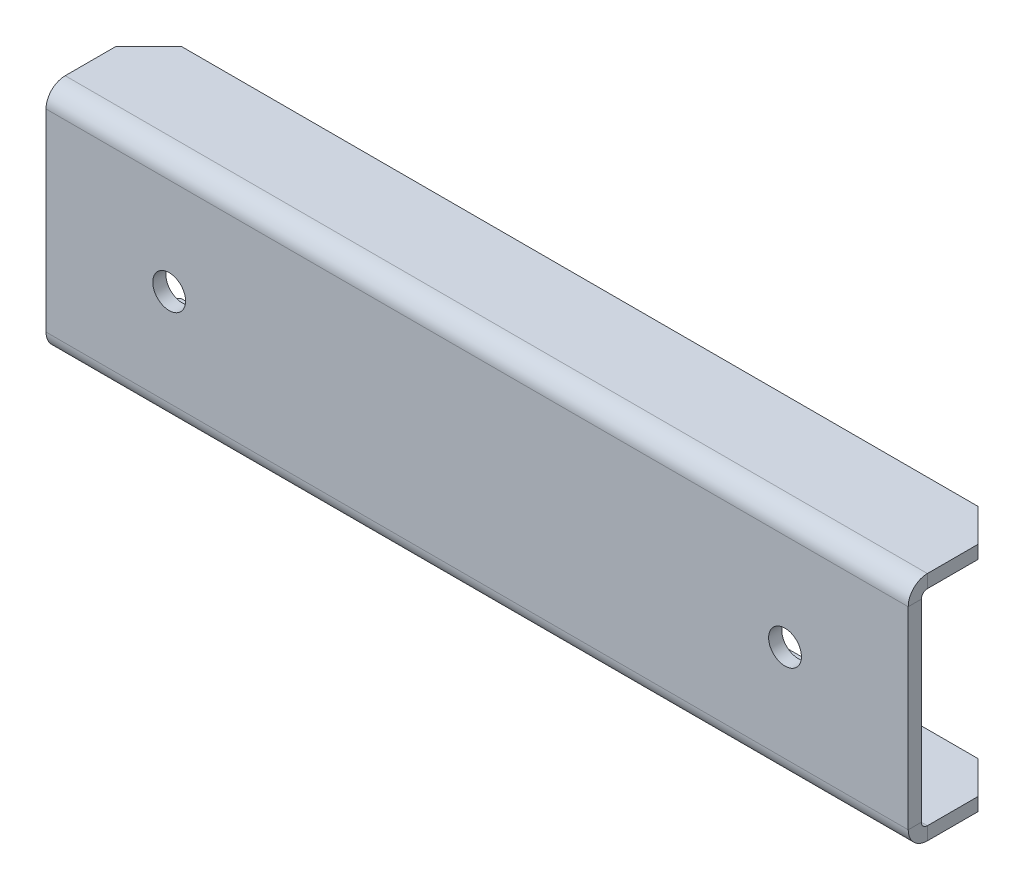
ISO-10303-21;
HEADER;
FILE_DESCRIPTION(('STEP AP214'),'2;1');
FILE_NAME('part.step','',(''),(''),'','','');
FILE_SCHEMA(('AUTOMOTIVE_DESIGN { 1 0 10303 214 1 1 1 1 }'));
ENDSEC;
DATA;
#1=APPLICATION_CONTEXT('core data for automotive mechanical design processes');
#2=APPLICATION_PROTOCOL_DEFINITION('international standard','automotive_design',2000,#1);
#3=PRODUCT_CONTEXT('',#1,'mechanical');
#4=PRODUCT('Part','Part','',(#3));
#5=PRODUCT_RELATED_PRODUCT_CATEGORY('part','',(#4));
#6=PRODUCT_DEFINITION_FORMATION('','',#4);
#7=PRODUCT_DEFINITION_CONTEXT('part definition',#1,'design');
#8=PRODUCT_DEFINITION('design','',#6,#7);
#9=PRODUCT_DEFINITION_SHAPE('','',#8);
#10=(LENGTH_UNIT() NAMED_UNIT(*) SI_UNIT(.MILLI.,.METRE.));
#11=(NAMED_UNIT(*) PLANE_ANGLE_UNIT() SI_UNIT($,.RADIAN.));
#12=(NAMED_UNIT(*) SI_UNIT($,.STERADIAN.) SOLID_ANGLE_UNIT());
#13=UNCERTAINTY_MEASURE_WITH_UNIT(LENGTH_MEASURE(1.E-05),#10,'distance_accuracy_value','');
#14=(GEOMETRIC_REPRESENTATION_CONTEXT(3) GLOBAL_UNCERTAINTY_ASSIGNED_CONTEXT((#13)) GLOBAL_UNIT_ASSIGNED_CONTEXT((#10,
#11,#12)) REPRESENTATION_CONTEXT('',''));
#15=CARTESIAN_POINT('',(0.,0.,0.));
#16=DIRECTION('',(0.,0.,1.));
#17=DIRECTION('',(1.,0.,0.));
#18=AXIS2_PLACEMENT_3D('',#15,#16,#17);
#19=CARTESIAN_POINT('',(-52.5,-12.5,-1.6));
#20=DIRECTION('',(0.,0.,1.));
#21=DIRECTION('',(1.,0.,0.));
#22=AXIS2_PLACEMENT_3D('',#19,#20,#21);
#23=PLANE('',#22);
#24=DIRECTION('',(-1.,0.,0.));
#25=VECTOR('',#24,1.);
#26=CARTESIAN_POINT('',(-52.5,-11.7634,-1.6));
#27=LINE('',#26,#25);
#28=CARTESIAN_POINT('',(-52.5,-11.7634,-1.6));
#29=VERTEX_POINT('',#28);
#30=CARTESIAN_POINT('',(52.5,-11.7634,-1.6));
#31=VERTEX_POINT('',#30);
#32=EDGE_CURVE('E300',#29,#31,#27,.F.);
#33=ORIENTED_EDGE('',*,*,#32,.F.);
#34=DIRECTION('',(0.,-1.,0.));
#35=VECTOR('',#34,1.);
#36=CARTESIAN_POINT('',(-52.5,12.5,-1.6));
#37=LINE('',#36,#35);
#38=CARTESIAN_POINT('',(-52.5,11.7634,-1.6));
#39=VERTEX_POINT('',#38);
#40=EDGE_CURVE('E45',#39,#29,#37,.T.);
#41=ORIENTED_EDGE('',*,*,#40,.F.);
#42=DIRECTION('',(1.,0.,0.));
#43=VECTOR('',#42,1.);
#44=CARTESIAN_POINT('',(52.5,11.7634,-1.6));
#45=LINE('',#44,#43);
#46=CARTESIAN_POINT('',(52.5,11.7634,-1.6));
#47=VERTEX_POINT('',#46);
#48=EDGE_CURVE('E175',#47,#39,#45,.F.);
#49=ORIENTED_EDGE('',*,*,#48,.F.);
#50=DIRECTION('',(0.,1.,0.));
#51=VECTOR('',#50,1.);
#52=CARTESIAN_POINT('',(52.5,12.5,-1.6));
#53=LINE('',#52,#51);
#54=EDGE_CURVE('E11',#31,#47,#53,.T.);
#55=ORIENTED_EDGE('',*,*,#54,.F.);
#56=EDGE_LOOP('',(#33,#41,#49,#55));
#57=FACE_BOUND('',#56,.T.);
#58=CARTESIAN_POINT('',(37.5,0.,-1.6));
#59=DIRECTION('',(0.,0.,-1.));
#60=DIRECTION('',(-1.,0.,0.));
#61=AXIS2_PLACEMENT_3D('',#58,#59,#60);
#62=CIRCLE('',#61,2.);
#63=CARTESIAN_POINT('',(35.5,0.,-1.6));
#64=VERTEX_POINT('',#63);
#65=EDGE_CURVE('E325',#64,#64,#62,.T.);
#66=ORIENTED_EDGE('',*,*,#65,.F.);
#67=EDGE_LOOP('',(#66));
#68=FACE_BOUND('',#67,.T.);
#69=CARTESIAN_POINT('',(-37.5,0.,-1.6));
#70=DIRECTION('',(0.,0.,1.));
#71=DIRECTION('',(1.,0.,0.));
#72=AXIS2_PLACEMENT_3D('',#69,#70,#71);
#73=CIRCLE('',#72,2.);
#74=CARTESIAN_POINT('',(-35.5,0.,-1.6));
#75=VERTEX_POINT('',#74);
#76=EDGE_CURVE('E328',#75,#75,#73,.T.);
#77=ORIENTED_EDGE('',*,*,#76,.T.);
#78=EDGE_LOOP('',(#77));
#79=FACE_BOUND('',#78,.T.);
#80=ADVANCED_FACE('F36',(#57,#68,#79),#23,.F.);
#81=CARTESIAN_POINT('',(-52.5,-12.5,0.));
#82=DIRECTION('',(0.,0.,1.));
#83=DIRECTION('',(1.,0.,0.));
#84=AXIS2_PLACEMENT_3D('',#81,#82,#83);
#85=PLANE('',#84);
#86=DIRECTION('',(0.,-1.,0.));
#87=VECTOR('',#86,1.);
#88=CARTESIAN_POINT('',(-52.5,12.5,0.));
#89=LINE('',#88,#87);
#90=CARTESIAN_POINT('',(-52.5,11.7634,0.));
#91=VERTEX_POINT('',#90);
#92=CARTESIAN_POINT('',(-52.5,-11.7634,0.));
#93=VERTEX_POINT('',#92);
#94=EDGE_CURVE('E207',#91,#93,#89,.T.);
#95=ORIENTED_EDGE('',*,*,#94,.T.);
#96=DIRECTION('',(-1.,0.,0.));
#97=VECTOR('',#96,1.);
#98=CARTESIAN_POINT('',(-52.5,-11.7634,0.));
#99=LINE('',#98,#97);
#100=CARTESIAN_POINT('',(52.5,-11.7634,0.));
#101=VERTEX_POINT('',#100);
#102=EDGE_CURVE('E219',#93,#101,#99,.F.);
#103=ORIENTED_EDGE('',*,*,#102,.T.);
#104=DIRECTION('',(0.,1.,0.));
#105=VECTOR('',#104,1.);
#106=CARTESIAN_POINT('',(52.5,12.5,0.));
#107=LINE('',#106,#105);
#108=CARTESIAN_POINT('',(52.5,11.7634,0.));
#109=VERTEX_POINT('',#108);
#110=EDGE_CURVE('E40',#101,#109,#107,.T.);
#111=ORIENTED_EDGE('',*,*,#110,.T.);
#112=DIRECTION('',(1.,0.,0.));
#113=VECTOR('',#112,1.);
#114=CARTESIAN_POINT('',(52.5,11.7634,0.));
#115=LINE('',#114,#113);
#116=EDGE_CURVE('E190',#109,#91,#115,.F.);
#117=ORIENTED_EDGE('',*,*,#116,.T.);
#118=EDGE_LOOP('',(#95,#103,#111,#117));
#119=FACE_BOUND('',#118,.T.);
#120=CARTESIAN_POINT('',(37.5,0.,0.));
#121=DIRECTION('',(0.,0.,-1.));
#122=DIRECTION('',(-1.,0.,0.));
#123=AXIS2_PLACEMENT_3D('',#120,#121,#122);
#124=CIRCLE('',#123,2.);
#125=CARTESIAN_POINT('',(35.5,0.,0.));
#126=VERTEX_POINT('',#125);
#127=EDGE_CURVE('E335',#126,#126,#124,.T.);
#128=ORIENTED_EDGE('',*,*,#127,.T.);
#129=EDGE_LOOP('',(#128));
#130=FACE_BOUND('',#129,.T.);
#131=CARTESIAN_POINT('',(-37.5,0.,0.));
#132=DIRECTION('',(0.,0.,1.));
#133=DIRECTION('',(1.,0.,0.));
#134=AXIS2_PLACEMENT_3D('',#131,#132,#133);
#135=CIRCLE('',#134,2.);
#136=CARTESIAN_POINT('',(-35.5,0.,0.));
#137=VERTEX_POINT('',#136);
#138=EDGE_CURVE('E330',#137,#137,#135,.T.);
#139=ORIENTED_EDGE('',*,*,#138,.F.);
#140=EDGE_LOOP('',(#139));
#141=FACE_BOUND('',#140,.T.);
#142=ADVANCED_FACE('F217',(#119,#130,#141),#85,.T.);
#143=CARTESIAN_POINT('',(52.5,14.1,-1.59999999999999));
#144=DIRECTION('',(0.,-1.,0.));
#145=DIRECTION('',(0.,0.,-1.));
#146=AXIS2_PLACEMENT_3D('',#143,#144,#145);
#147=PLANE('',#146);
#148=DIRECTION('',(-0.707106781186547,0.,0.707106781186548));
#149=VECTOR('',#148,1.);
#150=CARTESIAN_POINT('',(-3.45000000000006,14.1000000000002,-57.55));
#151=LINE('',#150,#149);
#152=CARTESIAN_POINT('',(-48.5,14.1,-12.5));
#153=VERTEX_POINT('',#152);
#154=CARTESIAN_POINT('',(-52.5,14.1,-8.5));
#155=VERTEX_POINT('',#154);
#156=EDGE_CURVE('E151',#153,#155,#151,.T.);
#157=ORIENTED_EDGE('',*,*,#156,.T.);
#158=DIRECTION('',(0.,0.,1.));
#159=VECTOR('',#158,1.);
#160=CARTESIAN_POINT('',(-52.5,14.1,-1.59999999999999));
#161=LINE('',#160,#159);
#162=CARTESIAN_POINT('',(-52.5,14.1,-2.33659999999999));
#163=VERTEX_POINT('',#162);
#164=EDGE_CURVE('E162',#155,#163,#161,.T.);
#165=ORIENTED_EDGE('',*,*,#164,.T.);
#166=DIRECTION('',(-1.,0.,0.));
#167=VECTOR('',#166,1.);
#168=CARTESIAN_POINT('',(52.5,14.1,-2.3366));
#169=LINE('',#168,#167);
#170=CARTESIAN_POINT('',(52.5,14.1,-2.3366));
#171=VERTEX_POINT('',#170);
#172=EDGE_CURVE('E185',#171,#163,#169,.T.);
#173=ORIENTED_EDGE('',*,*,#172,.F.);
#174=DIRECTION('',(0.,0.,-1.));
#175=VECTOR('',#174,1.);
#176=CARTESIAN_POINT('',(52.5,14.1,-12.5));
#177=LINE('',#176,#175);
#178=CARTESIAN_POINT('',(52.5,14.1,-8.5));
#179=VERTEX_POINT('',#178);
#180=EDGE_CURVE('E177',#171,#179,#177,.T.);
#181=ORIENTED_EDGE('',*,*,#180,.T.);
#182=DIRECTION('',(-0.707106781186547,0.,-0.707106781186548));
#183=VECTOR('',#182,1.);
#184=CARTESIAN_POINT('',(55.95,14.1,-5.04999999999999));
#185=LINE('',#184,#183);
#186=CARTESIAN_POINT('',(48.5,14.1,-12.5));
#187=VERTEX_POINT('',#186);
#188=EDGE_CURVE('E248',#179,#187,#185,.T.);
#189=ORIENTED_EDGE('',*,*,#188,.T.);
#190=DIRECTION('',(-1.,0.,0.));
#191=VECTOR('',#190,1.);
#192=CARTESIAN_POINT('',(-52.5,14.1,-12.5));
#193=LINE('',#192,#191);
#194=EDGE_CURVE('E166',#187,#153,#193,.T.);
#195=ORIENTED_EDGE('',*,*,#194,.T.);
#196=EDGE_LOOP('',(#157,#165,#173,#181,#189,#195));
#197=FACE_BOUND('',#196,.T.);
#198=ADVANCED_FACE('F160',(#197),#147,.F.);
#199=CARTESIAN_POINT('',(52.5,12.5,-1.6));
#200=DIRECTION('',(0.,-1.,0.));
#201=DIRECTION('',(0.,0.,-1.));
#202=AXIS2_PLACEMENT_3D('',#199,#200,#201);
#203=PLANE('',#202);
#204=DIRECTION('',(0.,0.,1.));
#205=VECTOR('',#204,1.);
#206=CARTESIAN_POINT('',(-52.5,12.5,-1.6));
#207=LINE('',#206,#205);
#208=CARTESIAN_POINT('',(-52.5,12.5,-8.50000000000001));
#209=VERTEX_POINT('',#208);
#210=CARTESIAN_POINT('',(-52.5,12.5,-2.3366));
#211=VERTEX_POINT('',#210);
#212=EDGE_CURVE('E188',#209,#211,#207,.T.);
#213=ORIENTED_EDGE('',*,*,#212,.F.);
#214=DIRECTION('',(-0.707106781186547,0.,0.707106781186548));
#215=VECTOR('',#214,1.);
#216=CARTESIAN_POINT('',(-3.45000000000006,12.5000000000002,-57.55));
#217=LINE('',#216,#215);
#218=CARTESIAN_POINT('',(-48.5,12.5,-12.5));
#219=VERTEX_POINT('',#218);
#220=EDGE_CURVE('E53',#219,#209,#217,.T.);
#221=ORIENTED_EDGE('',*,*,#220,.F.);
#222=DIRECTION('',(-1.,0.,0.));
#223=VECTOR('',#222,1.);
#224=CARTESIAN_POINT('',(-52.5,12.5,-12.5));
#225=LINE('',#224,#223);
#226=CARTESIAN_POINT('',(48.5,12.5,-12.5));
#227=VERTEX_POINT('',#226);
#228=EDGE_CURVE('E184',#227,#219,#225,.T.);
#229=ORIENTED_EDGE('',*,*,#228,.F.);
#230=DIRECTION('',(-0.707106781186547,0.,-0.707106781186548));
#231=VECTOR('',#230,1.);
#232=CARTESIAN_POINT('',(55.95,12.5,-5.05));
#233=LINE('',#232,#231);
#234=CARTESIAN_POINT('',(52.5,12.5,-8.5));
#235=VERTEX_POINT('',#234);
#236=EDGE_CURVE('E259',#235,#227,#233,.T.);
#237=ORIENTED_EDGE('',*,*,#236,.F.);
#238=DIRECTION('',(0.,0.,-1.));
#239=VECTOR('',#238,1.);
#240=CARTESIAN_POINT('',(52.5,12.5,-12.5));
#241=LINE('',#240,#239);
#242=CARTESIAN_POINT('',(52.5,12.5,-2.3366));
#243=VERTEX_POINT('',#242);
#244=EDGE_CURVE('E181',#243,#235,#241,.T.);
#245=ORIENTED_EDGE('',*,*,#244,.F.);
#246=DIRECTION('',(1.,0.,0.));
#247=VECTOR('',#246,1.);
#248=CARTESIAN_POINT('',(-52.5,12.5,-2.3366));
#249=LINE('',#248,#247);
#250=EDGE_CURVE('E234',#211,#243,#249,.T.);
#251=ORIENTED_EDGE('',*,*,#250,.F.);
#252=EDGE_LOOP('',(#213,#221,#229,#237,#245,#251));
#253=FACE_BOUND('',#252,.T.);
#254=ADVANCED_FACE('F364',(#253),#203,.T.);
#255=CARTESIAN_POINT('',(-52.5,14.1,-12.5));
#256=DIRECTION('',(0.,0.,1.));
#257=DIRECTION('',(0.,-1.,0.));
#258=AXIS2_PLACEMENT_3D('',#255,#256,#257);
#259=PLANE('',#258);
#260=DIRECTION('',(0.,-1.,0.));
#261=VECTOR('',#260,1.);
#262=CARTESIAN_POINT('',(-48.5,12.5,-12.5));
#263=LINE('',#262,#261);
#264=EDGE_CURVE('E156',#219,#153,#263,.F.);
#265=ORIENTED_EDGE('',*,*,#264,.T.);
#266=ORIENTED_EDGE('',*,*,#194,.F.);
#267=DIRECTION('',(0.,-1.,0.));
#268=VECTOR('',#267,1.);
#269=CARTESIAN_POINT('',(48.5,12.5,-12.5));
#270=LINE('',#269,#268);
#271=EDGE_CURVE('E255',#227,#187,#270,.F.);
#272=ORIENTED_EDGE('',*,*,#271,.F.);
#273=ORIENTED_EDGE('',*,*,#228,.T.);
#274=EDGE_LOOP('',(#265,#266,#272,#273));
#275=FACE_BOUND('',#274,.T.);
#276=ADVANCED_FACE('F363',(#275),#259,.F.);
#277=CARTESIAN_POINT('',(-52.5,14.1,-1.59999999999999));
#278=DIRECTION('',(1.,0.,0.));
#279=DIRECTION('',(0.,0.,-1.));
#280=AXIS2_PLACEMENT_3D('',#277,#278,#279);
#281=PLANE('',#280);
#282=DIRECTION('',(0.,-1.,0.));
#283=VECTOR('',#282,1.);
#284=CARTESIAN_POINT('',(-52.5,12.5,-8.5));
#285=LINE('',#284,#283);
#286=EDGE_CURVE('E148',#209,#155,#285,.F.);
#287=ORIENTED_EDGE('',*,*,#286,.F.);
#288=ORIENTED_EDGE('',*,*,#212,.T.);
#289=DIRECTION('',(0.,1.,0.));
#290=VECTOR('',#289,1.);
#291=CARTESIAN_POINT('',(-52.5,12.5,-2.3366));
#292=LINE('',#291,#290);
#293=EDGE_CURVE('E171',#211,#163,#292,.T.);
#294=ORIENTED_EDGE('',*,*,#293,.T.);
#295=ORIENTED_EDGE('',*,*,#164,.F.);
#296=EDGE_LOOP('',(#287,#288,#294,#295));
#297=FACE_BOUND('',#296,.T.);
#298=ADVANCED_FACE('F169',(#297),#281,.F.);
#299=CARTESIAN_POINT('',(-52.5,-14.1,-1.59999999999999));
#300=DIRECTION('',(0.,1.,0.));
#301=DIRECTION('',(0.,0.,1.));
#302=AXIS2_PLACEMENT_3D('',#299,#300,#301);
#303=PLANE('',#302);
#304=DIRECTION('',(0.707106781186547,0.,0.707106781186548));
#305=VECTOR('',#304,1.);
#306=CARTESIAN_POINT('',(3.45000000000006,-14.1000000000002,-57.55));
#307=LINE('',#306,#305);
#308=CARTESIAN_POINT('',(48.5,-14.1,-12.5));
#309=VERTEX_POINT('',#308);
#310=CARTESIAN_POINT('',(52.5,-14.1,-8.5));
#311=VERTEX_POINT('',#310);
#312=EDGE_CURVE('E341',#309,#311,#307,.T.);
#313=ORIENTED_EDGE('',*,*,#312,.T.);
#314=DIRECTION('',(0.,0.,1.));
#315=VECTOR('',#314,1.);
#316=CARTESIAN_POINT('',(52.5,-14.1,-1.59999999999999));
#317=LINE('',#316,#315);
#318=CARTESIAN_POINT('',(52.5,-14.1,-2.33659999999999));
#319=VERTEX_POINT('',#318);
#320=EDGE_CURVE('E281',#311,#319,#317,.T.);
#321=ORIENTED_EDGE('',*,*,#320,.T.);
#322=DIRECTION('',(1.,0.,0.));
#323=VECTOR('',#322,1.);
#324=CARTESIAN_POINT('',(-52.5,-14.1,-2.33659999999999));
#325=LINE('',#324,#323);
#326=CARTESIAN_POINT('',(-52.5,-14.1,-2.33659999999999));
#327=VERTEX_POINT('',#326);
#328=EDGE_CURVE('E268',#327,#319,#325,.T.);
#329=ORIENTED_EDGE('',*,*,#328,.F.);
#330=DIRECTION('',(0.,0.,-1.));
#331=VECTOR('',#330,1.);
#332=CARTESIAN_POINT('',(-52.5,-14.1,-12.5));
#333=LINE('',#332,#331);
#334=CARTESIAN_POINT('',(-52.5,-14.1,-8.5));
#335=VERTEX_POINT('',#334);
#336=EDGE_CURVE('E274',#327,#335,#333,.T.);
#337=ORIENTED_EDGE('',*,*,#336,.T.);
#338=DIRECTION('',(0.707106781186547,0.,-0.707106781186548));
#339=VECTOR('',#338,1.);
#340=CARTESIAN_POINT('',(-55.95,-14.1,-5.04999999999999));
#341=LINE('',#340,#339);
#342=CARTESIAN_POINT('',(-48.5,-14.1,-12.5));
#343=VERTEX_POINT('',#342);
#344=EDGE_CURVE('E351',#335,#343,#341,.T.);
#345=ORIENTED_EDGE('',*,*,#344,.T.);
#346=DIRECTION('',(1.,0.,0.));
#347=VECTOR('',#346,1.);
#348=CARTESIAN_POINT('',(52.5,-14.1,-12.5));
#349=LINE('',#348,#347);
#350=EDGE_CURVE('E277',#343,#309,#349,.T.);
#351=ORIENTED_EDGE('',*,*,#350,.T.);
#352=EDGE_LOOP('',(#313,#321,#329,#337,#345,#351));
#353=FACE_BOUND('',#352,.T.);
#354=ADVANCED_FACE('F421',(#353),#303,.F.);
#355=CARTESIAN_POINT('',(-52.5,-12.5,-1.6));
#356=DIRECTION('',(0.,1.,0.));
#357=DIRECTION('',(0.,0.,1.));
#358=AXIS2_PLACEMENT_3D('',#355,#356,#357);
#359=PLANE('',#358);
#360=DIRECTION('',(0.,0.,1.));
#361=VECTOR('',#360,1.);
#362=CARTESIAN_POINT('',(52.5,-12.5,-1.6));
#363=LINE('',#362,#361);
#364=CARTESIAN_POINT('',(52.5,-12.5,-8.49999999999999));
#365=VERTEX_POINT('',#364);
#366=CARTESIAN_POINT('',(52.5,-12.5,-2.3366));
#367=VERTEX_POINT('',#366);
#368=EDGE_CURVE('E278',#365,#367,#363,.T.);
#369=ORIENTED_EDGE('',*,*,#368,.F.);
#370=DIRECTION('',(0.707106781186547,0.,0.707106781186548));
#371=VECTOR('',#370,1.);
#372=CARTESIAN_POINT('',(3.45000000000006,-12.5000000000002,-57.55));
#373=LINE('',#372,#371);
#374=CARTESIAN_POINT('',(48.5,-12.5,-12.5));
#375=VERTEX_POINT('',#374);
#376=EDGE_CURVE('E61',#375,#365,#373,.T.);
#377=ORIENTED_EDGE('',*,*,#376,.F.);
#378=DIRECTION('',(1.,0.,0.));
#379=VECTOR('',#378,1.);
#380=CARTESIAN_POINT('',(52.5,-12.5,-12.5));
#381=LINE('',#380,#379);
#382=CARTESIAN_POINT('',(-48.5,-12.5,-12.5));
#383=VERTEX_POINT('',#382);
#384=EDGE_CURVE('E286',#383,#375,#381,.T.);
#385=ORIENTED_EDGE('',*,*,#384,.F.);
#386=DIRECTION('',(0.707106781186547,0.,-0.707106781186548));
#387=VECTOR('',#386,1.);
#388=CARTESIAN_POINT('',(-55.95,-12.5,-5.05));
#389=LINE('',#388,#387);
#390=CARTESIAN_POINT('',(-52.5,-12.5,-8.5));
#391=VERTEX_POINT('',#390);
#392=EDGE_CURVE('E348',#391,#383,#389,.T.);
#393=ORIENTED_EDGE('',*,*,#392,.F.);
#394=DIRECTION('',(0.,0.,-1.));
#395=VECTOR('',#394,1.);
#396=CARTESIAN_POINT('',(-52.5,-12.5,-12.5));
#397=LINE('',#396,#395);
#398=CARTESIAN_POINT('',(-52.5,-12.5,-2.3366));
#399=VERTEX_POINT('',#398);
#400=EDGE_CURVE('E273',#399,#391,#397,.T.);
#401=ORIENTED_EDGE('',*,*,#400,.F.);
#402=DIRECTION('',(-1.,0.,0.));
#403=VECTOR('',#402,1.);
#404=CARTESIAN_POINT('',(52.5,-12.5,-2.3366));
#405=LINE('',#404,#403);
#406=EDGE_CURVE('E263',#367,#399,#405,.T.);
#407=ORIENTED_EDGE('',*,*,#406,.F.);
#408=EDGE_LOOP('',(#369,#377,#385,#393,#401,#407));
#409=FACE_BOUND('',#408,.T.);
#410=ADVANCED_FACE('F437',(#409),#359,.T.);
#411=CARTESIAN_POINT('',(52.5,-14.1,-12.5));
#412=DIRECTION('',(0.,0.,1.));
#413=DIRECTION('',(0.,-1.,0.));
#414=AXIS2_PLACEMENT_3D('',#411,#412,#413);
#415=PLANE('',#414);
#416=DIRECTION('',(0.,1.,0.));
#417=VECTOR('',#416,1.);
#418=CARTESIAN_POINT('',(48.5,-12.5,-12.5));
#419=LINE('',#418,#417);
#420=EDGE_CURVE('E344',#375,#309,#419,.F.);
#421=ORIENTED_EDGE('',*,*,#420,.T.);
#422=ORIENTED_EDGE('',*,*,#350,.F.);
#423=DIRECTION('',(0.,1.,0.));
#424=VECTOR('',#423,1.);
#425=CARTESIAN_POINT('',(-48.5,-12.5,-12.5));
#426=LINE('',#425,#424);
#427=EDGE_CURVE('E356',#383,#343,#426,.F.);
#428=ORIENTED_EDGE('',*,*,#427,.F.);
#429=ORIENTED_EDGE('',*,*,#384,.T.);
#430=EDGE_LOOP('',(#421,#422,#428,#429));
#431=FACE_BOUND('',#430,.T.);
#432=ADVANCED_FACE('F401',(#431),#415,.F.);
#433=CARTESIAN_POINT('',(52.5,-14.1,-1.59999999999999));
#434=DIRECTION('',(-1.,0.,0.));
#435=DIRECTION('',(0.,0.,1.));
#436=AXIS2_PLACEMENT_3D('',#433,#434,#435);
#437=PLANE('',#436);
#438=DIRECTION('',(0.,1.,0.));
#439=VECTOR('',#438,1.);
#440=CARTESIAN_POINT('',(52.5,-12.5,-8.5));
#441=LINE('',#440,#439);
#442=EDGE_CURVE('E346',#365,#311,#441,.F.);
#443=ORIENTED_EDGE('',*,*,#442,.F.);
#444=ORIENTED_EDGE('',*,*,#368,.T.);
#445=DIRECTION('',(0.,-1.,0.));
#446=VECTOR('',#445,1.);
#447=CARTESIAN_POINT('',(52.5,-12.5,-2.3366));
#448=LINE('',#447,#446);
#449=EDGE_CURVE('E257',#367,#319,#448,.T.);
#450=ORIENTED_EDGE('',*,*,#449,.T.);
#451=ORIENTED_EDGE('',*,*,#320,.F.);
#452=EDGE_LOOP('',(#443,#444,#450,#451));
#453=FACE_BOUND('',#452,.T.);
#454=ADVANCED_FACE('F395',(#453),#437,.F.);
#455=CARTESIAN_POINT('',(-52.5,-14.1,-12.5));
#456=DIRECTION('',(1.,0.,0.));
#457=DIRECTION('',(0.,0.,-1.));
#458=AXIS2_PLACEMENT_3D('',#455,#456,#457);
#459=PLANE('',#458);
#460=DIRECTION('',(0.,1.,0.));
#461=VECTOR('',#460,1.);
#462=CARTESIAN_POINT('',(-52.5,-12.5,-8.5));
#463=LINE('',#462,#461);
#464=EDGE_CURVE('E354',#391,#335,#463,.F.);
#465=ORIENTED_EDGE('',*,*,#464,.T.);
#466=ORIENTED_EDGE('',*,*,#336,.F.);
#467=DIRECTION('',(0.,-1.,0.));
#468=VECTOR('',#467,1.);
#469=CARTESIAN_POINT('',(-52.5,-12.5,-2.33659999999999));
#470=LINE('',#469,#468);
#471=EDGE_CURVE('E265',#399,#327,#470,.T.);
#472=ORIENTED_EDGE('',*,*,#471,.F.);
#473=ORIENTED_EDGE('',*,*,#400,.T.);
#474=EDGE_LOOP('',(#465,#466,#472,#473));
#475=FACE_BOUND('',#474,.T.);
#476=ADVANCED_FACE('F391',(#475),#459,.F.);
#477=CARTESIAN_POINT('',(52.5,14.1,-12.5));
#478=DIRECTION('',(-1.,0.,0.));
#479=DIRECTION('',(0.,0.,1.));
#480=AXIS2_PLACEMENT_3D('',#477,#478,#479);
#481=PLANE('',#480);
#482=DIRECTION('',(0.,-1.,0.));
#483=VECTOR('',#482,1.);
#484=CARTESIAN_POINT('',(52.5,12.5,-8.5));
#485=LINE('',#484,#483);
#486=EDGE_CURVE('E252',#235,#179,#485,.F.);
#487=ORIENTED_EDGE('',*,*,#486,.T.);
#488=ORIENTED_EDGE('',*,*,#180,.F.);
#489=DIRECTION('',(0.,1.,0.));
#490=VECTOR('',#489,1.);
#491=CARTESIAN_POINT('',(52.5,12.5,-2.3366));
#492=LINE('',#491,#490);
#493=EDGE_CURVE('E237',#243,#171,#492,.T.);
#494=ORIENTED_EDGE('',*,*,#493,.F.);
#495=ORIENTED_EDGE('',*,*,#244,.T.);
#496=EDGE_LOOP('',(#487,#488,#494,#495));
#497=FACE_BOUND('',#496,.T.);
#498=ADVANCED_FACE('F251',(#497),#481,.F.);
#499=CARTESIAN_POINT('',(-52.5,12.5,-1.6));
#500=DIRECTION('',(-1.,0.,0.));
#501=DIRECTION('',(0.,0.,1.));
#502=AXIS2_PLACEMENT_3D('',#499,#500,#501);
#503=PLANE('',#502);
#504=ORIENTED_EDGE('',*,*,#40,.T.);
#505=DIRECTION('',(0.,0.,1.));
#506=VECTOR('',#505,1.);
#507=CARTESIAN_POINT('',(-52.5,-11.7634,-1.6));
#508=LINE('',#507,#506);
#509=EDGE_CURVE('E243',#29,#93,#508,.T.);
#510=ORIENTED_EDGE('',*,*,#509,.T.);
#511=ORIENTED_EDGE('',*,*,#94,.F.);
#512=DIRECTION('',(0.,0.,1.));
#513=VECTOR('',#512,1.);
#514=CARTESIAN_POINT('',(-52.5,11.7634,-1.6));
#515=LINE('',#514,#513);
#516=EDGE_CURVE('E204',#39,#91,#515,.T.);
#517=ORIENTED_EDGE('',*,*,#516,.F.);
#518=EDGE_LOOP('',(#504,#510,#511,#517));
#519=FACE_BOUND('',#518,.T.);
#520=ADVANCED_FACE('F38',(#519),#503,.T.);
#521=CARTESIAN_POINT('',(52.5,12.5,-1.6));
#522=DIRECTION('',(1.,0.,0.));
#523=DIRECTION('',(0.,0.,-1.));
#524=AXIS2_PLACEMENT_3D('',#521,#522,#523);
#525=PLANE('',#524);
#526=DIRECTION('',(0.,0.,1.));
#527=VECTOR('',#526,1.);
#528=CARTESIAN_POINT('',(52.5,-11.7634,-1.6));
#529=LINE('',#528,#527);
#530=EDGE_CURVE('E240',#31,#101,#529,.T.);
#531=ORIENTED_EDGE('',*,*,#530,.F.);
#532=ORIENTED_EDGE('',*,*,#54,.T.);
#533=DIRECTION('',(0.,0.,1.));
#534=VECTOR('',#533,1.);
#535=CARTESIAN_POINT('',(52.5,11.7634,-1.6));
#536=LINE('',#535,#534);
#537=EDGE_CURVE('E197',#47,#109,#536,.T.);
#538=ORIENTED_EDGE('',*,*,#537,.T.);
#539=ORIENTED_EDGE('',*,*,#110,.F.);
#540=EDGE_LOOP('',(#531,#532,#538,#539));
#541=FACE_BOUND('',#540,.T.);
#542=ADVANCED_FACE('F222',(#541),#525,.T.);
#543=CARTESIAN_POINT('',(-52.5,11.7634,-2.3366));
#544=DIRECTION('',(-1.,0.,0.));
#545=DIRECTION('',(0.,0.,1.));
#546=AXIS2_PLACEMENT_3D('',#543,#544,#545);
#547=PLANE('',#546);
#548=ORIENTED_EDGE('',*,*,#293,.F.);
#549=CARTESIAN_POINT('',(-52.5,11.7634,-2.3366));
#550=DIRECTION('',(1.,0.,0.));
#551=DIRECTION('',(0.,0.,-1.));
#552=AXIS2_PLACEMENT_3D('',#549,#550,#551);
#553=CIRCLE('',#552,0.736599999999999);
#554=EDGE_CURVE('E200',#39,#211,#553,.F.);
#555=ORIENTED_EDGE('',*,*,#554,.F.);
#556=ORIENTED_EDGE('',*,*,#516,.T.);
#557=CARTESIAN_POINT('',(-52.5,11.7634,-2.3366));
#558=DIRECTION('',(1.,0.,0.));
#559=DIRECTION('',(0.,0.,-1.));
#560=AXIS2_PLACEMENT_3D('',#557,#558,#559);
#561=CIRCLE('',#560,2.3366);
#562=EDGE_CURVE('E193',#91,#163,#561,.F.);
#563=ORIENTED_EDGE('',*,*,#562,.T.);
#564=EDGE_LOOP('',(#548,#555,#556,#563));
#565=FACE_BOUND('',#564,.T.);
#566=ADVANCED_FACE('F366',(#565),#547,.T.);
#567=CARTESIAN_POINT('',(52.5,11.7634,-2.3366));
#568=DIRECTION('',(-1.,0.,0.));
#569=DIRECTION('',(0.,0.,1.));
#570=AXIS2_PLACEMENT_3D('',#567,#568,#569);
#571=PLANE('',#570);
#572=CARTESIAN_POINT('',(52.5,11.7634,-2.3366));
#573=DIRECTION('',(1.,0.,0.));
#574=DIRECTION('',(0.,0.,-1.));
#575=AXIS2_PLACEMENT_3D('',#572,#573,#574);
#576=CIRCLE('',#575,0.736599999999999);
#577=EDGE_CURVE('E172',#243,#47,#576,.T.);
#578=ORIENTED_EDGE('',*,*,#577,.F.);
#579=ORIENTED_EDGE('',*,*,#493,.T.);
#580=CARTESIAN_POINT('',(52.5,11.7634,-2.3366));
#581=DIRECTION('',(1.,0.,0.));
#582=DIRECTION('',(0.,0.,-1.));
#583=AXIS2_PLACEMENT_3D('',#580,#581,#582);
#584=CIRCLE('',#583,2.3366);
#585=EDGE_CURVE('E194',#171,#109,#584,.T.);
#586=ORIENTED_EDGE('',*,*,#585,.T.);
#587=ORIENTED_EDGE('',*,*,#537,.F.);
#588=EDGE_LOOP('',(#578,#579,#586,#587));
#589=FACE_BOUND('',#588,.T.);
#590=ADVANCED_FACE('F227',(#589),#571,.F.);
#591=CARTESIAN_POINT('',(52.5,11.7634,-2.3366));
#592=DIRECTION('',(1.,0.,0.));
#593=DIRECTION('',(0.,1.,0.));
#594=AXIS2_PLACEMENT_3D('',#591,#592,#593);
#595=CYLINDRICAL_SURFACE('',#594,2.3366);
#596=ORIENTED_EDGE('',*,*,#116,.F.);
#597=ORIENTED_EDGE('',*,*,#585,.F.);
#598=ORIENTED_EDGE('',*,*,#172,.T.);
#599=ORIENTED_EDGE('',*,*,#562,.F.);
#600=EDGE_LOOP('',(#596,#597,#598,#599));
#601=FACE_BOUND('',#600,.T.);
#602=ADVANCED_FACE('F368',(#601),#595,.T.);
#603=CARTESIAN_POINT('',(52.5,11.7634,-2.3366));
#604=DIRECTION('',(1.,0.,0.));
#605=DIRECTION('',(0.,1.,0.));
#606=AXIS2_PLACEMENT_3D('',#603,#604,#605);
#607=CYLINDRICAL_SURFACE('',#606,0.736599999999999);
#608=ORIENTED_EDGE('',*,*,#48,.T.);
#609=ORIENTED_EDGE('',*,*,#554,.T.);
#610=ORIENTED_EDGE('',*,*,#250,.T.);
#611=ORIENTED_EDGE('',*,*,#577,.T.);
#612=EDGE_LOOP('',(#608,#609,#610,#611));
#613=FACE_BOUND('',#612,.T.);
#614=ADVANCED_FACE('F231',(#613),#607,.F.);
#615=CARTESIAN_POINT('',(52.5,-11.7634,-2.3366));
#616=DIRECTION('',(1.,0.,0.));
#617=DIRECTION('',(0.,0.,-1.));
#618=AXIS2_PLACEMENT_3D('',#615,#616,#617);
#619=PLANE('',#618);
#620=ORIENTED_EDGE('',*,*,#449,.F.);
#621=CARTESIAN_POINT('',(52.5,-11.7634,-2.3366));
#622=DIRECTION('',(-1.,0.,0.));
#623=DIRECTION('',(0.,0.,1.));
#624=AXIS2_PLACEMENT_3D('',#621,#622,#623);
#625=CIRCLE('',#624,0.736599999999999);
#626=EDGE_CURVE('E297',#31,#367,#625,.F.);
#627=ORIENTED_EDGE('',*,*,#626,.F.);
#628=ORIENTED_EDGE('',*,*,#530,.T.);
#629=CARTESIAN_POINT('',(52.5,-11.7634,-2.3366));
#630=DIRECTION('',(-1.,0.,0.));
#631=DIRECTION('',(0.,0.,1.));
#632=AXIS2_PLACEMENT_3D('',#629,#630,#631);
#633=CIRCLE('',#632,2.3366);
#634=EDGE_CURVE('E291',#101,#319,#633,.F.);
#635=ORIENTED_EDGE('',*,*,#634,.T.);
#636=EDGE_LOOP('',(#620,#627,#628,#635));
#637=FACE_BOUND('',#636,.T.);
#638=ADVANCED_FACE('F375',(#637),#619,.T.);
#639=CARTESIAN_POINT('',(-52.5,-11.7634,-2.3366));
#640=DIRECTION('',(1.,0.,0.));
#641=DIRECTION('',(0.,0.,-1.));
#642=AXIS2_PLACEMENT_3D('',#639,#640,#641);
#643=PLANE('',#642);
#644=CARTESIAN_POINT('',(-52.5,-11.7634,-2.3366));
#645=DIRECTION('',(-1.,0.,0.));
#646=DIRECTION('',(0.,0.,1.));
#647=AXIS2_PLACEMENT_3D('',#644,#645,#646);
#648=CIRCLE('',#647,0.736599999999999);
#649=EDGE_CURVE('E283',#399,#29,#648,.T.);
#650=ORIENTED_EDGE('',*,*,#649,.F.);
#651=ORIENTED_EDGE('',*,*,#471,.T.);
#652=CARTESIAN_POINT('',(-52.5,-11.7634,-2.3366));
#653=DIRECTION('',(-1.,0.,0.));
#654=DIRECTION('',(0.,0.,1.));
#655=AXIS2_PLACEMENT_3D('',#652,#653,#654);
#656=CIRCLE('',#655,2.3366);
#657=EDGE_CURVE('E292',#327,#93,#656,.T.);
#658=ORIENTED_EDGE('',*,*,#657,.T.);
#659=ORIENTED_EDGE('',*,*,#509,.F.);
#660=EDGE_LOOP('',(#650,#651,#658,#659));
#661=FACE_BOUND('',#660,.T.);
#662=ADVANCED_FACE('F312',(#661),#643,.F.);
#663=CARTESIAN_POINT('',(-52.5,-11.7634,-2.3366));
#664=DIRECTION('',(-1.,0.,0.));
#665=DIRECTION('',(0.,-1.,0.));
#666=AXIS2_PLACEMENT_3D('',#663,#664,#665);
#667=CYLINDRICAL_SURFACE('',#666,2.3366);
#668=ORIENTED_EDGE('',*,*,#102,.F.);
#669=ORIENTED_EDGE('',*,*,#657,.F.);
#670=ORIENTED_EDGE('',*,*,#328,.T.);
#671=ORIENTED_EDGE('',*,*,#634,.F.);
#672=EDGE_LOOP('',(#668,#669,#670,#671));
#673=FACE_BOUND('',#672,.T.);
#674=ADVANCED_FACE('F406',(#673),#667,.T.);
#675=CARTESIAN_POINT('',(-52.5,-11.7634,-2.3366));
#676=DIRECTION('',(-1.,0.,0.));
#677=DIRECTION('',(0.,-1.,0.));
#678=AXIS2_PLACEMENT_3D('',#675,#676,#677);
#679=CYLINDRICAL_SURFACE('',#678,0.736599999999999);
#680=ORIENTED_EDGE('',*,*,#32,.T.);
#681=ORIENTED_EDGE('',*,*,#626,.T.);
#682=ORIENTED_EDGE('',*,*,#406,.T.);
#683=ORIENTED_EDGE('',*,*,#649,.T.);
#684=EDGE_LOOP('',(#680,#681,#682,#683));
#685=FACE_BOUND('',#684,.T.);
#686=ADVANCED_FACE('F316',(#685),#679,.F.);
#687=CARTESIAN_POINT('',(55.95,12.5,-5.05));
#688=DIRECTION('',(-0.707106781186548,0.,0.707106781186547));
#689=DIRECTION('',(-0.707106781186547,0.,-0.707106781186548));
#690=AXIS2_PLACEMENT_3D('',#687,#688,#689);
#691=PLANE('',#690);
#692=ORIENTED_EDGE('',*,*,#236,.T.);
#693=ORIENTED_EDGE('',*,*,#271,.T.);
#694=ORIENTED_EDGE('',*,*,#188,.F.);
#695=ORIENTED_EDGE('',*,*,#486,.F.);
#696=EDGE_LOOP('',(#692,#693,#694,#695));
#697=FACE_BOUND('',#696,.T.);
#698=ADVANCED_FACE('F360',(#697),#691,.F.);
#699=CARTESIAN_POINT('',(-55.95,-12.5,-5.05));
#700=DIRECTION('',(0.707106781186548,0.,0.707106781186547));
#701=DIRECTION('',(0.707106781186547,0.,-0.707106781186548));
#702=AXIS2_PLACEMENT_3D('',#699,#700,#701);
#703=PLANE('',#702);
#704=ORIENTED_EDGE('',*,*,#392,.T.);
#705=ORIENTED_EDGE('',*,*,#427,.T.);
#706=ORIENTED_EDGE('',*,*,#344,.F.);
#707=ORIENTED_EDGE('',*,*,#464,.F.);
#708=EDGE_LOOP('',(#704,#705,#706,#707));
#709=FACE_BOUND('',#708,.T.);
#710=ADVANCED_FACE('F475',(#709),#703,.F.);
#711=CARTESIAN_POINT('',(3.45000000000006,-12.5000000000002,-57.55));
#712=DIRECTION('',(-0.707106781186548,0.,0.707106781186547));
#713=DIRECTION('',(0.707106781186547,0.,0.707106781186548));
#714=AXIS2_PLACEMENT_3D('',#711,#712,#713);
#715=PLANE('',#714);
#716=ORIENTED_EDGE('',*,*,#376,.T.);
#717=ORIENTED_EDGE('',*,*,#442,.T.);
#718=ORIENTED_EDGE('',*,*,#312,.F.);
#719=ORIENTED_EDGE('',*,*,#420,.F.);
#720=EDGE_LOOP('',(#716,#717,#718,#719));
#721=FACE_BOUND('',#720,.T.);
#722=ADVANCED_FACE('F486',(#721),#715,.F.);
#723=CARTESIAN_POINT('',(-3.45000000000006,12.5000000000002,-57.55));
#724=DIRECTION('',(0.707106781186548,0.,0.707106781186547));
#725=DIRECTION('',(-0.707106781186547,0.,0.707106781186548));
#726=AXIS2_PLACEMENT_3D('',#723,#724,#725);
#727=PLANE('',#726);
#728=ORIENTED_EDGE('',*,*,#220,.T.);
#729=ORIENTED_EDGE('',*,*,#286,.T.);
#730=ORIENTED_EDGE('',*,*,#156,.F.);
#731=ORIENTED_EDGE('',*,*,#264,.F.);
#732=EDGE_LOOP('',(#728,#729,#730,#731));
#733=FACE_BOUND('',#732,.T.);
#734=ADVANCED_FACE('F150',(#733),#727,.F.);
#735=CARTESIAN_POINT('',(37.5,0.,0.));
#736=DIRECTION('',(0.,0.,-1.));
#737=DIRECTION('',(-1.,0.,0.));
#738=AXIS2_PLACEMENT_3D('',#735,#736,#737);
#739=CYLINDRICAL_SURFACE('',#738,2.);
#740=ORIENTED_EDGE('',*,*,#127,.F.);
#741=EDGE_LOOP('',(#740));
#742=FACE_BOUND('',#741,.T.);
#743=ORIENTED_EDGE('',*,*,#65,.T.);
#744=EDGE_LOOP('',(#743));
#745=FACE_BOUND('',#744,.T.);
#746=ADVANCED_FACE('F506',(#742,#745),#739,.F.);
#747=CARTESIAN_POINT('',(-37.5,0.,0.));
#748=DIRECTION('',(0.,0.,-1.));
#749=DIRECTION('',(-1.,0.,0.));
#750=AXIS2_PLACEMENT_3D('',#747,#748,#749);
#751=CYLINDRICAL_SURFACE('',#750,2.);
#752=ORIENTED_EDGE('',*,*,#138,.T.);
#753=EDGE_LOOP('',(#752));
#754=FACE_BOUND('',#753,.T.);
#755=ORIENTED_EDGE('',*,*,#76,.F.);
#756=EDGE_LOOP('',(#755));
#757=FACE_BOUND('',#756,.T.);
#758=ADVANCED_FACE('F516',(#754,#757),#751,.F.);
#759=CLOSED_SHELL('',(#80,#142,#198,#254,#276,#298,#354,#410,#432,#454,#476,#498,#520,#542,#566,
#590,#602,#614,#638,#662,#674,#686,#698,#710,#722,#734,#746,#758));
#760=MANIFOLD_SOLID_BREP('B2',#759);
#761=ADVANCED_BREP_SHAPE_REPRESENTATION('',(#18,#760),#14);
#762=SHAPE_DEFINITION_REPRESENTATION(#9,#761);
ENDSEC;
END-ISO-10303-21;
